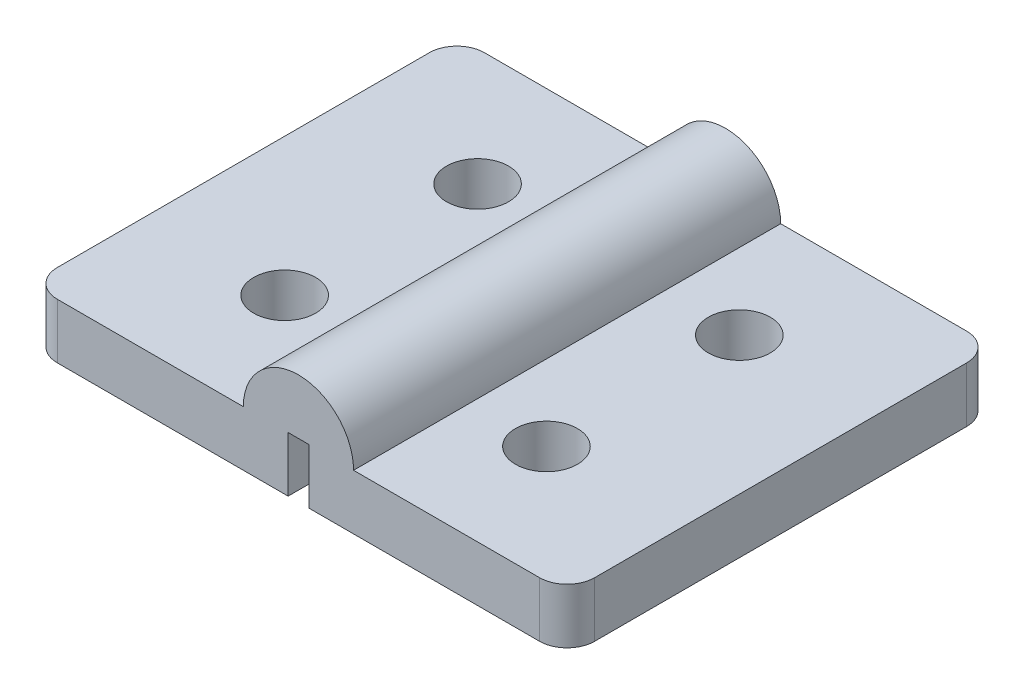
ISO-10303-21;
HEADER;
FILE_DESCRIPTION(('STEP AP214'),'2;1');
FILE_NAME('part.step','',(''),(''),'','','');
FILE_SCHEMA(('AUTOMOTIVE_DESIGN { 1 0 10303 214 1 1 1 1 }'));
ENDSEC;
DATA;
#1=APPLICATION_CONTEXT('core data for automotive mechanical design processes');
#2=APPLICATION_PROTOCOL_DEFINITION('international standard','automotive_design',2000,#1);
#3=PRODUCT_CONTEXT('',#1,'mechanical');
#4=PRODUCT('Part','Part','',(#3));
#5=PRODUCT_RELATED_PRODUCT_CATEGORY('part','',(#4));
#6=PRODUCT_DEFINITION_FORMATION('','',#4);
#7=PRODUCT_DEFINITION_CONTEXT('part definition',#1,'design');
#8=PRODUCT_DEFINITION('design','',#6,#7);
#9=PRODUCT_DEFINITION_SHAPE('','',#8);
#10=(LENGTH_UNIT() NAMED_UNIT(*) SI_UNIT(.MILLI.,.METRE.));
#11=(NAMED_UNIT(*) PLANE_ANGLE_UNIT() SI_UNIT($,.RADIAN.));
#12=(NAMED_UNIT(*) SI_UNIT($,.STERADIAN.) SOLID_ANGLE_UNIT());
#13=UNCERTAINTY_MEASURE_WITH_UNIT(LENGTH_MEASURE(1.E-05),#10,'distance_accuracy_value','');
#14=(GEOMETRIC_REPRESENTATION_CONTEXT(3) GLOBAL_UNCERTAINTY_ASSIGNED_CONTEXT((#13)) GLOBAL_UNIT_ASSIGNED_CONTEXT((#10,
#11,#12)) REPRESENTATION_CONTEXT('',''));
#15=CARTESIAN_POINT('',(0.,0.,0.));
#16=DIRECTION('',(0.,0.,1.));
#17=DIRECTION('',(1.,0.,0.));
#18=AXIS2_PLACEMENT_3D('',#15,#16,#17);
#19=CARTESIAN_POINT('',(0.,0.,0.));
#20=DIRECTION('',(0.,-1.,0.));
#21=DIRECTION('',(0.,0.,-1.));
#22=AXIS2_PLACEMENT_3D('',#19,#20,#21);
#23=PLANE('',#22);
#24=DIRECTION('',(1.,0.,0.));
#25=VECTOR('',#24,1.);
#26=CARTESIAN_POINT('',(0.,0.,0.));
#27=LINE('',#26,#25);
#28=CARTESIAN_POINT('',(2.,0.,0.));
#29=VERTEX_POINT('',#28);
#30=CARTESIAN_POINT('',(18.75,0.,0.));
#31=VERTEX_POINT('',#30);
#32=EDGE_CURVE('E220',#29,#31,#27,.T.);
#33=ORIENTED_EDGE('',*,*,#32,.F.);
#34=CARTESIAN_POINT('',(2.,0.,-2.));
#35=DIRECTION('',(0.,-1.,0.));
#36=DIRECTION('',(0.,0.,-1.));
#37=AXIS2_PLACEMENT_3D('',#34,#35,#36);
#38=CIRCLE('',#37,2.);
#39=CARTESIAN_POINT('',(0.,0.,-2.));
#40=VERTEX_POINT('',#39);
#41=EDGE_CURVE('E250',#29,#40,#38,.T.);
#42=ORIENTED_EDGE('',*,*,#41,.T.);
#43=DIRECTION('',(0.,0.,1.));
#44=VECTOR('',#43,1.);
#45=CARTESIAN_POINT('',(0.,0.,0.));
#46=LINE('',#45,#44);
#47=CARTESIAN_POINT('',(0.,0.,-29.));
#48=VERTEX_POINT('',#47);
#49=EDGE_CURVE('E203',#48,#40,#46,.T.);
#50=ORIENTED_EDGE('',*,*,#49,.F.);
#51=CARTESIAN_POINT('',(2.,0.,-29.));
#52=DIRECTION('',(0.,-1.,0.));
#53=DIRECTION('',(0.,0.,-1.));
#54=AXIS2_PLACEMENT_3D('',#51,#52,#53);
#55=CIRCLE('',#54,2.);
#56=CARTESIAN_POINT('',(2.,0.,-31.));
#57=VERTEX_POINT('',#56);
#58=EDGE_CURVE('E248',#48,#57,#55,.T.);
#59=ORIENTED_EDGE('',*,*,#58,.T.);
#60=DIRECTION('',(-1.,0.,0.));
#61=VECTOR('',#60,1.);
#62=CARTESIAN_POINT('',(0.,0.,-31.));
#63=LINE('',#62,#61);
#64=CARTESIAN_POINT('',(18.75,0.,-31.));
#65=VERTEX_POINT('',#64);
#66=EDGE_CURVE('E225',#65,#57,#63,.T.);
#67=ORIENTED_EDGE('',*,*,#66,.F.);
#68=DIRECTION('',(0.,0.,-1.));
#69=VECTOR('',#68,1.);
#70=CARTESIAN_POINT('',(18.75,0.,4.27200187265876));
#71=LINE('',#70,#69);
#72=EDGE_CURVE('E164',#31,#65,#71,.T.);
#73=ORIENTED_EDGE('',*,*,#72,.F.);
#74=EDGE_LOOP('',(#33,#42,#50,#59,#67,#73));
#75=FACE_BOUND('',#74,.T.);
#76=CARTESIAN_POINT('',(10.,0.,-22.5));
#77=DIRECTION('',(0.,1.,0.));
#78=DIRECTION('',(0.,0.,1.));
#79=AXIS2_PLACEMENT_3D('',#76,#77,#78);
#80=CIRCLE('',#79,2.25);
#81=CARTESIAN_POINT('',(10.,0.,-20.25));
#82=VERTEX_POINT('',#81);
#83=EDGE_CURVE('E197',#82,#82,#80,.T.);
#84=ORIENTED_EDGE('',*,*,#83,.T.);
#85=EDGE_LOOP('',(#84));
#86=FACE_BOUND('',#85,.T.);
#87=CARTESIAN_POINT('',(10.,0.,-8.5));
#88=DIRECTION('',(0.,1.,0.));
#89=DIRECTION('',(0.,0.,1.));
#90=AXIS2_PLACEMENT_3D('',#87,#88,#89);
#91=CIRCLE('',#90,2.25);
#92=CARTESIAN_POINT('',(10.,0.,-6.25));
#93=VERTEX_POINT('',#92);
#94=EDGE_CURVE('E181',#93,#93,#91,.T.);
#95=ORIENTED_EDGE('',*,*,#94,.T.);
#96=EDGE_LOOP('',(#95));
#97=FACE_BOUND('',#96,.T.);
#98=ADVANCED_FACE('F32',(#75,#86,#97),#23,.T.);
#99=CARTESIAN_POINT('',(0.,4.,0.));
#100=DIRECTION('',(0.,-1.,0.));
#101=DIRECTION('',(0.,0.,-1.));
#102=AXIS2_PLACEMENT_3D('',#99,#100,#101);
#103=PLANE('',#102);
#104=CARTESIAN_POINT('',(29.,4.,-8.5));
#105=DIRECTION('',(0.,1.,0.));
#106=DIRECTION('',(0.,0.,1.));
#107=AXIS2_PLACEMENT_3D('',#104,#105,#106);
#108=CIRCLE('',#107,2.25);
#109=CARTESIAN_POINT('',(29.,4.,-6.25));
#110=VERTEX_POINT('',#109);
#111=EDGE_CURVE('E188',#110,#110,#108,.T.);
#112=ORIENTED_EDGE('',*,*,#111,.F.);
#113=EDGE_LOOP('',(#112));
#114=FACE_BOUND('',#113,.T.);
#115=CARTESIAN_POINT('',(29.,4.,-22.5));
#116=DIRECTION('',(0.,1.,0.));
#117=DIRECTION('',(0.,0.,1.));
#118=AXIS2_PLACEMENT_3D('',#115,#116,#117);
#119=CIRCLE('',#118,2.25);
#120=CARTESIAN_POINT('',(29.,4.,-20.25));
#121=VERTEX_POINT('',#120);
#122=EDGE_CURVE('E194',#121,#121,#119,.T.);
#123=ORIENTED_EDGE('',*,*,#122,.F.);
#124=EDGE_LOOP('',(#123));
#125=FACE_BOUND('',#124,.T.);
#126=DIRECTION('',(0.,0.,-1.));
#127=VECTOR('',#126,1.);
#128=CARTESIAN_POINT('',(39.,4.,0.));
#129=LINE('',#128,#127);
#130=CARTESIAN_POINT('',(39.,4.,-2.));
#131=VERTEX_POINT('',#130);
#132=CARTESIAN_POINT('',(39.,4.,-29.));
#133=VERTEX_POINT('',#132);
#134=EDGE_CURVE('E211',#131,#133,#129,.T.);
#135=ORIENTED_EDGE('',*,*,#134,.T.);
#136=CARTESIAN_POINT('',(37.,4.,-29.));
#137=DIRECTION('',(0.,-1.,0.));
#138=DIRECTION('',(0.,0.,-1.));
#139=AXIS2_PLACEMENT_3D('',#136,#137,#138);
#140=CIRCLE('',#139,2.);
#141=CARTESIAN_POINT('',(37.,4.,-31.));
#142=VERTEX_POINT('',#141);
#143=EDGE_CURVE('E241',#133,#142,#140,.F.);
#144=ORIENTED_EDGE('',*,*,#143,.T.);
#145=DIRECTION('',(-1.,0.,0.));
#146=VECTOR('',#145,1.);
#147=CARTESIAN_POINT('',(0.,4.,-31.));
#148=LINE('',#147,#146);
#149=CARTESIAN_POINT('',(23.5,4.,-31.));
#150=VERTEX_POINT('',#149);
#151=EDGE_CURVE('E215',#142,#150,#148,.T.);
#152=ORIENTED_EDGE('',*,*,#151,.T.);
#153=DIRECTION('',(0.,0.,1.));
#154=VECTOR('',#153,1.);
#155=CARTESIAN_POINT('',(23.5,4.,-42.3137084989848));
#156=LINE('',#155,#154);
#157=CARTESIAN_POINT('',(23.5,4.,0.));
#158=VERTEX_POINT('',#157);
#159=EDGE_CURVE('E179',#150,#158,#156,.T.);
#160=ORIENTED_EDGE('',*,*,#159,.T.);
#161=DIRECTION('',(1.,0.,0.));
#162=VECTOR('',#161,1.);
#163=CARTESIAN_POINT('',(0.,4.,0.));
#164=LINE('',#163,#162);
#165=CARTESIAN_POINT('',(37.,4.,0.));
#166=VERTEX_POINT('',#165);
#167=EDGE_CURVE('E208',#158,#166,#164,.T.);
#168=ORIENTED_EDGE('',*,*,#167,.T.);
#169=CARTESIAN_POINT('',(37.,4.,-2.));
#170=DIRECTION('',(0.,-1.,0.));
#171=DIRECTION('',(0.,0.,-1.));
#172=AXIS2_PLACEMENT_3D('',#169,#170,#171);
#173=CIRCLE('',#172,2.);
#174=EDGE_CURVE('E239',#166,#131,#173,.F.);
#175=ORIENTED_EDGE('',*,*,#174,.T.);
#176=EDGE_LOOP('',(#135,#144,#152,#160,#168,#175));
#177=FACE_BOUND('',#176,.T.);
#178=ADVANCED_FACE('F292',(#114,#125,#177),#103,.F.);
#179=DIRECTION('',(0.,0.,1.));
#180=VECTOR('',#179,1.);
#181=CARTESIAN_POINT('',(0.,4.,0.));
#182=LINE('',#181,#180);
#183=CARTESIAN_POINT('',(0.,4.,-29.));
#184=VERTEX_POINT('',#183);
#185=CARTESIAN_POINT('',(0.,4.,-2.));
#186=VERTEX_POINT('',#185);
#187=EDGE_CURVE('E206',#184,#186,#182,.T.);
#188=ORIENTED_EDGE('',*,*,#187,.T.);
#189=CARTESIAN_POINT('',(2.,4.,-2.));
#190=DIRECTION('',(0.,-1.,0.));
#191=DIRECTION('',(0.,0.,-1.));
#192=AXIS2_PLACEMENT_3D('',#189,#190,#191);
#193=CIRCLE('',#192,2.);
#194=CARTESIAN_POINT('',(2.,4.,0.));
#195=VERTEX_POINT('',#194);
#196=EDGE_CURVE('E11',#186,#195,#193,.F.);
#197=ORIENTED_EDGE('',*,*,#196,.T.);
#198=CARTESIAN_POINT('',(15.5,4.,0.));
#199=VERTEX_POINT('',#198);
#200=EDGE_CURVE('E209',#195,#199,#164,.T.);
#201=ORIENTED_EDGE('',*,*,#200,.T.);
#202=DIRECTION('',(0.,0.,1.));
#203=VECTOR('',#202,1.);
#204=CARTESIAN_POINT('',(15.5,4.,-42.3137084989848));
#205=LINE('',#204,#203);
#206=CARTESIAN_POINT('',(15.5,4.,-31.));
#207=VERTEX_POINT('',#206);
#208=EDGE_CURVE('E176',#199,#207,#205,.F.);
#209=ORIENTED_EDGE('',*,*,#208,.T.);
#210=CARTESIAN_POINT('',(2.,4.,-31.));
#211=VERTEX_POINT('',#210);
#212=EDGE_CURVE('E214',#207,#211,#148,.T.);
#213=ORIENTED_EDGE('',*,*,#212,.T.);
#214=CARTESIAN_POINT('',(2.,4.,-29.));
#215=DIRECTION('',(0.,-1.,0.));
#216=DIRECTION('',(0.,0.,-1.));
#217=AXIS2_PLACEMENT_3D('',#214,#215,#216);
#218=CIRCLE('',#217,2.);
#219=EDGE_CURVE('E40',#211,#184,#218,.F.);
#220=ORIENTED_EDGE('',*,*,#219,.T.);
#221=EDGE_LOOP('',(#188,#197,#201,#209,#213,#220));
#222=FACE_BOUND('',#221,.T.);
#223=CARTESIAN_POINT('',(10.,4.,-22.5));
#224=DIRECTION('',(0.,1.,0.));
#225=DIRECTION('',(0.,0.,1.));
#226=AXIS2_PLACEMENT_3D('',#223,#224,#225);
#227=CIRCLE('',#226,2.25);
#228=CARTESIAN_POINT('',(10.,4.,-20.25));
#229=VERTEX_POINT('',#228);
#230=EDGE_CURVE('E200',#229,#229,#227,.T.);
#231=ORIENTED_EDGE('',*,*,#230,.F.);
#232=EDGE_LOOP('',(#231));
#233=FACE_BOUND('',#232,.T.);
#234=CARTESIAN_POINT('',(10.,4.,-8.5));
#235=DIRECTION('',(0.,1.,0.));
#236=DIRECTION('',(0.,0.,1.));
#237=AXIS2_PLACEMENT_3D('',#234,#235,#236);
#238=CIRCLE('',#237,2.25);
#239=CARTESIAN_POINT('',(10.,4.,-6.25));
#240=VERTEX_POINT('',#239);
#241=EDGE_CURVE('E182',#240,#240,#238,.T.);
#242=ORIENTED_EDGE('',*,*,#241,.F.);
#243=EDGE_LOOP('',(#242));
#244=FACE_BOUND('',#243,.T.);
#245=ADVANCED_FACE('F278',(#222,#233,#244),#103,.F.);
#246=CARTESIAN_POINT('',(37.,0.,-31.));
#247=VERTEX_POINT('',#246);
#248=CARTESIAN_POINT('',(20.25,0.,-31.));
#249=VERTEX_POINT('',#248);
#250=EDGE_CURVE('E159',#247,#249,#63,.T.);
#251=ORIENTED_EDGE('',*,*,#250,.F.);
#252=CARTESIAN_POINT('',(37.,0.,-29.));
#253=DIRECTION('',(0.,-1.,0.));
#254=DIRECTION('',(0.,0.,-1.));
#255=AXIS2_PLACEMENT_3D('',#252,#253,#254);
#256=CIRCLE('',#255,2.);
#257=CARTESIAN_POINT('',(39.,0.,-29.));
#258=VERTEX_POINT('',#257);
#259=EDGE_CURVE('E232',#247,#258,#256,.T.);
#260=ORIENTED_EDGE('',*,*,#259,.T.);
#261=DIRECTION('',(0.,0.,-1.));
#262=VECTOR('',#261,1.);
#263=CARTESIAN_POINT('',(39.,0.,0.));
#264=LINE('',#263,#262);
#265=CARTESIAN_POINT('',(39.,0.,-2.));
#266=VERTEX_POINT('',#265);
#267=EDGE_CURVE('E222',#266,#258,#264,.T.);
#268=ORIENTED_EDGE('',*,*,#267,.F.);
#269=CARTESIAN_POINT('',(37.,0.,-2.));
#270=DIRECTION('',(0.,-1.,0.));
#271=DIRECTION('',(0.,0.,-1.));
#272=AXIS2_PLACEMENT_3D('',#269,#270,#271);
#273=CIRCLE('',#272,2.);
#274=CARTESIAN_POINT('',(37.,0.,0.));
#275=VERTEX_POINT('',#274);
#276=EDGE_CURVE('E230',#266,#275,#273,.T.);
#277=ORIENTED_EDGE('',*,*,#276,.T.);
#278=CARTESIAN_POINT('',(20.25,0.,0.));
#279=VERTEX_POINT('',#278);
#280=EDGE_CURVE('E219',#279,#275,#27,.T.);
#281=ORIENTED_EDGE('',*,*,#280,.F.);
#282=DIRECTION('',(0.,0.,-1.));
#283=VECTOR('',#282,1.);
#284=CARTESIAN_POINT('',(20.25,0.,4.27200187265876));
#285=LINE('',#284,#283);
#286=EDGE_CURVE('E143',#279,#249,#285,.T.);
#287=ORIENTED_EDGE('',*,*,#286,.T.);
#288=EDGE_LOOP('',(#251,#260,#268,#277,#281,#287));
#289=FACE_BOUND('',#288,.T.);
#290=CARTESIAN_POINT('',(29.,0.,-8.5));
#291=DIRECTION('',(0.,1.,0.));
#292=DIRECTION('',(0.,0.,1.));
#293=AXIS2_PLACEMENT_3D('',#290,#291,#292);
#294=CIRCLE('',#293,2.25);
#295=CARTESIAN_POINT('',(29.,0.,-6.25));
#296=VERTEX_POINT('',#295);
#297=EDGE_CURVE('E185',#296,#296,#294,.T.);
#298=ORIENTED_EDGE('',*,*,#297,.T.);
#299=EDGE_LOOP('',(#298));
#300=FACE_BOUND('',#299,.T.);
#301=CARTESIAN_POINT('',(29.,0.,-22.5));
#302=DIRECTION('',(0.,1.,0.));
#303=DIRECTION('',(0.,0.,1.));
#304=AXIS2_PLACEMENT_3D('',#301,#302,#303);
#305=CIRCLE('',#304,2.25);
#306=CARTESIAN_POINT('',(29.,0.,-20.25));
#307=VERTEX_POINT('',#306);
#308=EDGE_CURVE('E191',#307,#307,#305,.T.);
#309=ORIENTED_EDGE('',*,*,#308,.T.);
#310=EDGE_LOOP('',(#309));
#311=FACE_BOUND('',#310,.T.);
#312=ADVANCED_FACE('F294',(#289,#300,#311),#23,.T.);
#313=CARTESIAN_POINT('',(0.,4.,0.));
#314=DIRECTION('',(1.,0.,0.));
#315=DIRECTION('',(0.,0.,-1.));
#316=AXIS2_PLACEMENT_3D('',#313,#314,#315);
#317=PLANE('',#316);
#318=ORIENTED_EDGE('',*,*,#49,.T.);
#319=DIRECTION('',(0.,-1.,0.));
#320=VECTOR('',#319,1.);
#321=CARTESIAN_POINT('',(0.,4.,-2.));
#322=LINE('',#321,#320);
#323=EDGE_CURVE('E47',#40,#186,#322,.F.);
#324=ORIENTED_EDGE('',*,*,#323,.T.);
#325=ORIENTED_EDGE('',*,*,#187,.F.);
#326=DIRECTION('',(0.,-1.,0.));
#327=VECTOR('',#326,1.);
#328=CARTESIAN_POINT('',(0.,4.,-29.));
#329=LINE('',#328,#327);
#330=EDGE_CURVE('E252',#184,#48,#329,.T.);
#331=ORIENTED_EDGE('',*,*,#330,.T.);
#332=EDGE_LOOP('',(#318,#324,#325,#331));
#333=FACE_BOUND('',#332,.T.);
#334=ADVANCED_FACE('F257',(#333),#317,.F.);
#335=CARTESIAN_POINT('',(0.,4.,0.));
#336=DIRECTION('',(0.,0.,-1.));
#337=DIRECTION('',(-1.,0.,0.));
#338=AXIS2_PLACEMENT_3D('',#335,#336,#337);
#339=PLANE('',#338);
#340=ORIENTED_EDGE('',*,*,#280,.T.);
#341=DIRECTION('',(0.,-1.,0.));
#342=VECTOR('',#341,1.);
#343=CARTESIAN_POINT('',(37.,4.,0.));
#344=LINE('',#343,#342);
#345=EDGE_CURVE('E246',#275,#166,#344,.F.);
#346=ORIENTED_EDGE('',*,*,#345,.T.);
#347=ORIENTED_EDGE('',*,*,#167,.F.);
#348=CARTESIAN_POINT('',(19.5,4.,0.));
#349=DIRECTION('',(0.,0.,1.));
#350=DIRECTION('',(1.,0.,0.));
#351=AXIS2_PLACEMENT_3D('',#348,#349,#350);
#352=CIRCLE('',#351,4.);
#353=EDGE_CURVE('E169',#158,#199,#352,.T.);
#354=ORIENTED_EDGE('',*,*,#353,.T.);
#355=ORIENTED_EDGE('',*,*,#200,.F.);
#356=DIRECTION('',(0.,-1.,0.));
#357=VECTOR('',#356,1.);
#358=CARTESIAN_POINT('',(2.,4.,0.));
#359=LINE('',#358,#357);
#360=EDGE_CURVE('E243',#195,#29,#359,.T.);
#361=ORIENTED_EDGE('',*,*,#360,.T.);
#362=ORIENTED_EDGE('',*,*,#32,.T.);
#363=DIRECTION('',(0.,-1.,0.));
#364=VECTOR('',#363,1.);
#365=CARTESIAN_POINT('',(18.75,0.,0.));
#366=LINE('',#365,#364);
#367=CARTESIAN_POINT('',(18.75,4.,0.));
#368=VERTEX_POINT('',#367);
#369=EDGE_CURVE('E170',#368,#31,#366,.T.);
#370=ORIENTED_EDGE('',*,*,#369,.F.);
#371=DIRECTION('',(-1.,0.,0.));
#372=VECTOR('',#371,1.);
#373=CARTESIAN_POINT('',(18.75,4.,0.));
#374=LINE('',#373,#372);
#375=CARTESIAN_POINT('',(20.25,4.,0.));
#376=VERTEX_POINT('',#375);
#377=EDGE_CURVE('E167',#376,#368,#374,.T.);
#378=ORIENTED_EDGE('',*,*,#377,.F.);
#379=DIRECTION('',(0.,1.,0.));
#380=VECTOR('',#379,1.);
#381=CARTESIAN_POINT('',(20.25,0.,0.));
#382=LINE('',#381,#380);
#383=EDGE_CURVE('E140',#279,#376,#382,.T.);
#384=ORIENTED_EDGE('',*,*,#383,.F.);
#385=EDGE_LOOP('',(#340,#346,#347,#354,#355,#361,#362,#370,#378,#384));
#386=FACE_BOUND('',#385,.T.);
#387=ADVANCED_FACE('F272',(#386),#339,.F.);
#388=CARTESIAN_POINT('',(39.,4.,0.));
#389=DIRECTION('',(-1.,0.,0.));
#390=DIRECTION('',(0.,0.,1.));
#391=AXIS2_PLACEMENT_3D('',#388,#389,#390);
#392=PLANE('',#391);
#393=ORIENTED_EDGE('',*,*,#267,.T.);
#394=DIRECTION('',(0.,-1.,0.));
#395=VECTOR('',#394,1.);
#396=CARTESIAN_POINT('',(39.,4.,-29.));
#397=LINE('',#396,#395);
#398=EDGE_CURVE('E237',#258,#133,#397,.F.);
#399=ORIENTED_EDGE('',*,*,#398,.T.);
#400=ORIENTED_EDGE('',*,*,#134,.F.);
#401=DIRECTION('',(0.,-1.,0.));
#402=VECTOR('',#401,1.);
#403=CARTESIAN_POINT('',(39.,4.,-2.));
#404=LINE('',#403,#402);
#405=EDGE_CURVE('E234',#131,#266,#404,.T.);
#406=ORIENTED_EDGE('',*,*,#405,.T.);
#407=EDGE_LOOP('',(#393,#399,#400,#406));
#408=FACE_BOUND('',#407,.T.);
#409=ADVANCED_FACE('F406',(#408),#392,.F.);
#410=CARTESIAN_POINT('',(0.,4.,-31.));
#411=DIRECTION('',(0.,0.,1.));
#412=DIRECTION('',(1.,0.,0.));
#413=AXIS2_PLACEMENT_3D('',#410,#411,#412);
#414=PLANE('',#413);
#415=ORIENTED_EDGE('',*,*,#151,.F.);
#416=DIRECTION('',(0.,-1.,0.));
#417=VECTOR('',#416,1.);
#418=CARTESIAN_POINT('',(37.,4.,-31.));
#419=LINE('',#418,#417);
#420=EDGE_CURVE('E228',#142,#247,#419,.T.);
#421=ORIENTED_EDGE('',*,*,#420,.T.);
#422=ORIENTED_EDGE('',*,*,#250,.T.);
#423=DIRECTION('',(0.,-1.,0.));
#424=VECTOR('',#423,1.);
#425=CARTESIAN_POINT('',(20.25,0.,-31.));
#426=LINE('',#425,#424);
#427=CARTESIAN_POINT('',(20.25,4.,-31.));
#428=VERTEX_POINT('',#427);
#429=EDGE_CURVE('E137',#428,#249,#426,.T.);
#430=ORIENTED_EDGE('',*,*,#429,.F.);
#431=DIRECTION('',(1.,0.,0.));
#432=VECTOR('',#431,1.);
#433=CARTESIAN_POINT('',(18.75,4.,-31.));
#434=LINE('',#433,#432);
#435=CARTESIAN_POINT('',(18.75,4.,-31.));
#436=VERTEX_POINT('',#435);
#437=EDGE_CURVE('E148',#436,#428,#434,.T.);
#438=ORIENTED_EDGE('',*,*,#437,.F.);
#439=DIRECTION('',(0.,1.,0.));
#440=VECTOR('',#439,1.);
#441=CARTESIAN_POINT('',(18.75,0.,-31.));
#442=LINE('',#441,#440);
#443=EDGE_CURVE('E153',#65,#436,#442,.T.);
#444=ORIENTED_EDGE('',*,*,#443,.F.);
#445=ORIENTED_EDGE('',*,*,#66,.T.);
#446=DIRECTION('',(0.,-1.,0.));
#447=VECTOR('',#446,1.);
#448=CARTESIAN_POINT('',(2.,4.,-31.));
#449=LINE('',#448,#447);
#450=EDGE_CURVE('E217',#57,#211,#449,.F.);
#451=ORIENTED_EDGE('',*,*,#450,.T.);
#452=ORIENTED_EDGE('',*,*,#212,.F.);
#453=CARTESIAN_POINT('',(19.5,4.,-31.));
#454=DIRECTION('',(0.,0.,1.));
#455=DIRECTION('',(1.,0.,0.));
#456=AXIS2_PLACEMENT_3D('',#453,#454,#455);
#457=CIRCLE('',#456,4.);
#458=EDGE_CURVE('E173',#207,#150,#457,.F.);
#459=ORIENTED_EDGE('',*,*,#458,.T.);
#460=EDGE_LOOP('',(#415,#421,#422,#430,#438,#444,#445,#451,#452,#459));
#461=FACE_BOUND('',#460,.T.);
#462=ADVANCED_FACE('F156',(#461),#414,.F.);
#463=CARTESIAN_POINT('',(10.,4.,-22.5));
#464=DIRECTION('',(0.,-1.,0.));
#465=DIRECTION('',(0.,0.,-1.));
#466=AXIS2_PLACEMENT_3D('',#463,#464,#465);
#467=CYLINDRICAL_SURFACE('',#466,2.25);
#468=ORIENTED_EDGE('',*,*,#230,.T.);
#469=EDGE_LOOP('',(#468));
#470=FACE_BOUND('',#469,.T.);
#471=ORIENTED_EDGE('',*,*,#83,.F.);
#472=EDGE_LOOP('',(#471));
#473=FACE_BOUND('',#472,.T.);
#474=ADVANCED_FACE('F316',(#470,#473),#467,.F.);
#475=CARTESIAN_POINT('',(29.,4.,-22.5));
#476=DIRECTION('',(0.,-1.,0.));
#477=DIRECTION('',(0.,0.,-1.));
#478=AXIS2_PLACEMENT_3D('',#475,#476,#477);
#479=CYLINDRICAL_SURFACE('',#478,2.25);
#480=ORIENTED_EDGE('',*,*,#122,.T.);
#481=EDGE_LOOP('',(#480));
#482=FACE_BOUND('',#481,.T.);
#483=ORIENTED_EDGE('',*,*,#308,.F.);
#484=EDGE_LOOP('',(#483));
#485=FACE_BOUND('',#484,.T.);
#486=ADVANCED_FACE('F313',(#482,#485),#479,.F.);
#487=CARTESIAN_POINT('',(29.,4.,-8.5));
#488=DIRECTION('',(0.,-1.,0.));
#489=DIRECTION('',(0.,0.,-1.));
#490=AXIS2_PLACEMENT_3D('',#487,#488,#489);
#491=CYLINDRICAL_SURFACE('',#490,2.25);
#492=ORIENTED_EDGE('',*,*,#111,.T.);
#493=EDGE_LOOP('',(#492));
#494=FACE_BOUND('',#493,.T.);
#495=ORIENTED_EDGE('',*,*,#297,.F.);
#496=EDGE_LOOP('',(#495));
#497=FACE_BOUND('',#496,.T.);
#498=ADVANCED_FACE('F315',(#494,#497),#491,.F.);
#499=CARTESIAN_POINT('',(10.,4.,-8.5));
#500=DIRECTION('',(0.,-1.,0.));
#501=DIRECTION('',(0.,0.,-1.));
#502=AXIS2_PLACEMENT_3D('',#499,#500,#501);
#503=CYLINDRICAL_SURFACE('',#502,2.25);
#504=ORIENTED_EDGE('',*,*,#241,.T.);
#505=EDGE_LOOP('',(#504));
#506=FACE_BOUND('',#505,.T.);
#507=ORIENTED_EDGE('',*,*,#94,.F.);
#508=EDGE_LOOP('',(#507));
#509=FACE_BOUND('',#508,.T.);
#510=ADVANCED_FACE('F323',(#506,#509),#503,.F.);
#511=CARTESIAN_POINT('',(19.5,4.,-42.3137084989848));
#512=DIRECTION('',(0.,0.,1.));
#513=DIRECTION('',(1.,0.,0.));
#514=AXIS2_PLACEMENT_3D('',#511,#512,#513);
#515=CYLINDRICAL_SURFACE('',#514,4.);
#516=ORIENTED_EDGE('',*,*,#159,.F.);
#517=ORIENTED_EDGE('',*,*,#458,.F.);
#518=ORIENTED_EDGE('',*,*,#208,.F.);
#519=ORIENTED_EDGE('',*,*,#353,.F.);
#520=EDGE_LOOP('',(#516,#517,#518,#519));
#521=FACE_BOUND('',#520,.T.);
#522=ADVANCED_FACE('F283',(#521),#515,.T.);
#523=CARTESIAN_POINT('',(18.75,0.,4.27200187265876));
#524=DIRECTION('',(-1.,0.,0.));
#525=DIRECTION('',(0.,0.,1.));
#526=AXIS2_PLACEMENT_3D('',#523,#524,#525);
#527=PLANE('',#526);
#528=ORIENTED_EDGE('',*,*,#369,.T.);
#529=ORIENTED_EDGE('',*,*,#72,.T.);
#530=ORIENTED_EDGE('',*,*,#443,.T.);
#531=DIRECTION('',(0.,0.,-1.));
#532=VECTOR('',#531,1.);
#533=CARTESIAN_POINT('',(18.75,4.,4.27200187265876));
#534=LINE('',#533,#532);
#535=EDGE_CURVE('E144',#368,#436,#534,.T.);
#536=ORIENTED_EDGE('',*,*,#535,.F.);
#537=EDGE_LOOP('',(#528,#529,#530,#536));
#538=FACE_BOUND('',#537,.T.);
#539=ADVANCED_FACE('F334',(#538),#527,.F.);
#540=CARTESIAN_POINT('',(20.25,0.,4.27200187265876));
#541=DIRECTION('',(1.,0.,0.));
#542=DIRECTION('',(0.,0.,-1.));
#543=AXIS2_PLACEMENT_3D('',#540,#541,#542);
#544=PLANE('',#543);
#545=ORIENTED_EDGE('',*,*,#383,.T.);
#546=DIRECTION('',(0.,0.,-1.));
#547=VECTOR('',#546,1.);
#548=CARTESIAN_POINT('',(20.25,4.,4.27200187265876));
#549=LINE('',#548,#547);
#550=EDGE_CURVE('E133',#376,#428,#549,.T.);
#551=ORIENTED_EDGE('',*,*,#550,.T.);
#552=ORIENTED_EDGE('',*,*,#429,.T.);
#553=ORIENTED_EDGE('',*,*,#286,.F.);
#554=EDGE_LOOP('',(#545,#551,#552,#553));
#555=FACE_BOUND('',#554,.T.);
#556=ADVANCED_FACE('F135',(#555),#544,.F.);
#557=CARTESIAN_POINT('',(18.75,4.,4.27200187265876));
#558=DIRECTION('',(0.,1.,0.));
#559=DIRECTION('',(0.,0.,1.));
#560=AXIS2_PLACEMENT_3D('',#557,#558,#559);
#561=PLANE('',#560);
#562=ORIENTED_EDGE('',*,*,#377,.T.);
#563=ORIENTED_EDGE('',*,*,#535,.T.);
#564=ORIENTED_EDGE('',*,*,#437,.T.);
#565=ORIENTED_EDGE('',*,*,#550,.F.);
#566=EDGE_LOOP('',(#562,#563,#564,#565));
#567=FACE_BOUND('',#566,.T.);
#568=ADVANCED_FACE('F149',(#567),#561,.F.);
#569=CARTESIAN_POINT('',(37.,4.,-29.));
#570=DIRECTION('',(0.,-1.,0.));
#571=DIRECTION('',(0.,0.,-1.));
#572=AXIS2_PLACEMENT_3D('',#569,#570,#571);
#573=CYLINDRICAL_SURFACE('',#572,2.);
#574=ORIENTED_EDGE('',*,*,#143,.F.);
#575=ORIENTED_EDGE('',*,*,#398,.F.);
#576=ORIENTED_EDGE('',*,*,#259,.F.);
#577=ORIENTED_EDGE('',*,*,#420,.F.);
#578=EDGE_LOOP('',(#574,#575,#576,#577));
#579=FACE_BOUND('',#578,.T.);
#580=ADVANCED_FACE('F340',(#579),#573,.T.);
#581=CARTESIAN_POINT('',(37.,4.,-2.));
#582=DIRECTION('',(0.,-1.,0.));
#583=DIRECTION('',(0.,0.,-1.));
#584=AXIS2_PLACEMENT_3D('',#581,#582,#583);
#585=CYLINDRICAL_SURFACE('',#584,2.);
#586=ORIENTED_EDGE('',*,*,#174,.F.);
#587=ORIENTED_EDGE('',*,*,#345,.F.);
#588=ORIENTED_EDGE('',*,*,#276,.F.);
#589=ORIENTED_EDGE('',*,*,#405,.F.);
#590=EDGE_LOOP('',(#586,#587,#588,#589));
#591=FACE_BOUND('',#590,.T.);
#592=ADVANCED_FACE('F290',(#591),#585,.T.);
#593=CARTESIAN_POINT('',(2.,4.,-2.));
#594=DIRECTION('',(0.,-1.,0.));
#595=DIRECTION('',(0.,0.,-1.));
#596=AXIS2_PLACEMENT_3D('',#593,#594,#595);
#597=CYLINDRICAL_SURFACE('',#596,2.);
#598=ORIENTED_EDGE('',*,*,#196,.F.);
#599=ORIENTED_EDGE('',*,*,#323,.F.);
#600=ORIENTED_EDGE('',*,*,#41,.F.);
#601=ORIENTED_EDGE('',*,*,#360,.F.);
#602=EDGE_LOOP('',(#598,#599,#600,#601));
#603=FACE_BOUND('',#602,.T.);
#604=ADVANCED_FACE('F268',(#603),#597,.T.);
#605=CARTESIAN_POINT('',(2.,4.,-29.));
#606=DIRECTION('',(0.,-1.,0.));
#607=DIRECTION('',(0.,0.,-1.));
#608=AXIS2_PLACEMENT_3D('',#605,#606,#607);
#609=CYLINDRICAL_SURFACE('',#608,2.);
#610=ORIENTED_EDGE('',*,*,#219,.F.);
#611=ORIENTED_EDGE('',*,*,#450,.F.);
#612=ORIENTED_EDGE('',*,*,#58,.F.);
#613=ORIENTED_EDGE('',*,*,#330,.F.);
#614=EDGE_LOOP('',(#610,#611,#612,#613));
#615=FACE_BOUND('',#614,.T.);
#616=ADVANCED_FACE('F34',(#615),#609,.T.);
#617=CLOSED_SHELL('',(#98,#178,#245,#312,#334,#387,#409,#462,#474,#486,#498,#510,#522,#539,#556,
#568,#580,#592,#604,#616));
#618=MANIFOLD_SOLID_BREP('B2',#617);
#619=ADVANCED_BREP_SHAPE_REPRESENTATION('',(#18,#618),#14);
#620=SHAPE_DEFINITION_REPRESENTATION(#9,#619);
ENDSEC;
END-ISO-10303-21;
